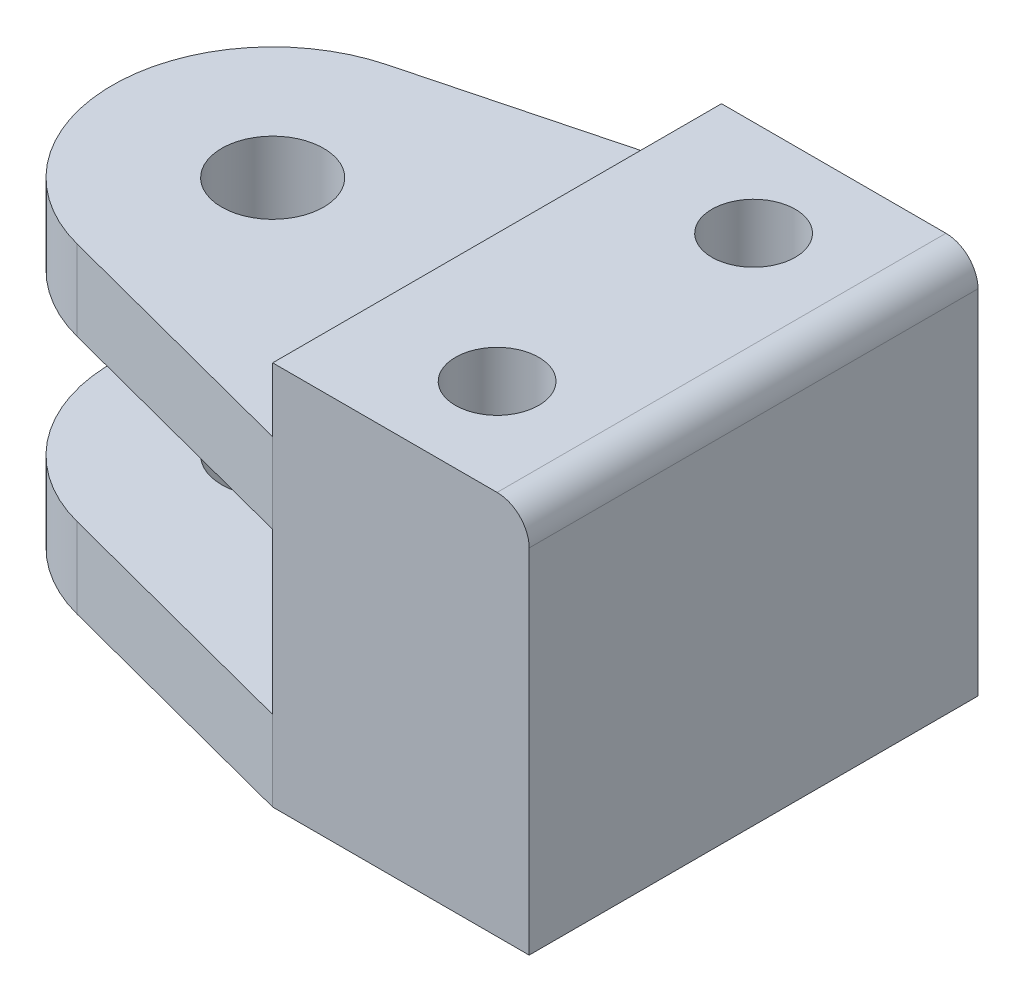
ISO-10303-21;
HEADER;
FILE_DESCRIPTION(('STEP AP214'),'2;1');
FILE_NAME('part.step','',(''),(''),'','','');
FILE_SCHEMA(('AUTOMOTIVE_DESIGN { 1 0 10303 214 1 1 1 1 }'));
ENDSEC;
DATA;
#1=APPLICATION_CONTEXT('core data for automotive mechanical design processes');
#2=APPLICATION_PROTOCOL_DEFINITION('international standard','automotive_design',2000,#1);
#3=PRODUCT_CONTEXT('',#1,'mechanical');
#4=PRODUCT('Part','Part','',(#3));
#5=PRODUCT_RELATED_PRODUCT_CATEGORY('part','',(#4));
#6=PRODUCT_DEFINITION_FORMATION('','',#4);
#7=PRODUCT_DEFINITION_CONTEXT('part definition',#1,'design');
#8=PRODUCT_DEFINITION('design','',#6,#7);
#9=PRODUCT_DEFINITION_SHAPE('','',#8);
#10=(LENGTH_UNIT() NAMED_UNIT(*) SI_UNIT(.MILLI.,.METRE.));
#11=(NAMED_UNIT(*) PLANE_ANGLE_UNIT() SI_UNIT($,.RADIAN.));
#12=(NAMED_UNIT(*) SI_UNIT($,.STERADIAN.) SOLID_ANGLE_UNIT());
#13=UNCERTAINTY_MEASURE_WITH_UNIT(LENGTH_MEASURE(1.E-05),#10,'distance_accuracy_value','');
#14=(GEOMETRIC_REPRESENTATION_CONTEXT(3) GLOBAL_UNCERTAINTY_ASSIGNED_CONTEXT((#13)) GLOBAL_UNIT_ASSIGNED_CONTEXT((#10,
#11,#12)) REPRESENTATION_CONTEXT('',''));
#15=CARTESIAN_POINT('',(0.,0.,0.));
#16=DIRECTION('',(0.,0.,1.));
#17=DIRECTION('',(1.,0.,0.));
#18=AXIS2_PLACEMENT_3D('',#15,#16,#17);
#19=CARTESIAN_POINT('',(11.,7.,-4.));
#20=DIRECTION('',(0.,1.,0.));
#21=DIRECTION('',(0.,0.,1.));
#22=AXIS2_PLACEMENT_3D('',#19,#20,#21);
#23=CYLINDRICAL_SURFACE('',#22,1.29999999999999);
#24=CARTESIAN_POINT('',(11.,7.,-4.));
#25=DIRECTION('',(0.,1.,0.));
#26=DIRECTION('',(0.,0.,1.));
#27=AXIS2_PLACEMENT_3D('',#24,#25,#26);
#28=CIRCLE('',#27,1.29999999999999);
#29=CARTESIAN_POINT('',(11.,7.,-2.70000000000001));
#30=VERTEX_POINT('',#29);
#31=EDGE_CURVE('E307',#30,#30,#28,.T.);
#32=ORIENTED_EDGE('',*,*,#31,.T.);
#33=EDGE_LOOP('',(#32));
#34=FACE_BOUND('',#33,.T.);
#35=CARTESIAN_POINT('',(11.,-2.,-4.));
#36=DIRECTION('',(0.,-1.,0.));
#37=DIRECTION('',(0.,0.,-1.));
#38=AXIS2_PLACEMENT_3D('',#35,#36,#37);
#39=CIRCLE('',#38,1.29999999999999);
#40=CARTESIAN_POINT('',(11.,-2.,-5.29999999999999));
#41=VERTEX_POINT('',#40);
#42=EDGE_CURVE('E247',#41,#41,#39,.F.);
#43=ORIENTED_EDGE('',*,*,#42,.F.);
#44=EDGE_LOOP('',(#43));
#45=FACE_BOUND('',#44,.T.);
#46=ADVANCED_FACE('F36',(#34,#45),#23,.F.);
#47=CARTESIAN_POINT('',(11.,7.,4.));
#48=DIRECTION('',(0.,1.,0.));
#49=DIRECTION('',(0.,0.,1.));
#50=AXIS2_PLACEMENT_3D('',#47,#48,#49);
#51=CYLINDRICAL_SURFACE('',#50,1.29999999999999);
#52=CARTESIAN_POINT('',(11.,7.,4.));
#53=DIRECTION('',(0.,1.,0.));
#54=DIRECTION('',(0.,0.,1.));
#55=AXIS2_PLACEMENT_3D('',#52,#53,#54);
#56=CIRCLE('',#55,1.29999999999999);
#57=CARTESIAN_POINT('',(11.,7.,5.29999999999999));
#58=VERTEX_POINT('',#57);
#59=EDGE_CURVE('E304',#58,#58,#56,.T.);
#60=ORIENTED_EDGE('',*,*,#59,.T.);
#61=EDGE_LOOP('',(#60));
#62=FACE_BOUND('',#61,.T.);
#63=CARTESIAN_POINT('',(11.,-2.,4.));
#64=DIRECTION('',(0.,-1.,0.));
#65=DIRECTION('',(0.,0.,-1.));
#66=AXIS2_PLACEMENT_3D('',#63,#64,#65);
#67=CIRCLE('',#66,1.29999999999999);
#68=CARTESIAN_POINT('',(11.,-2.,2.70000000000001));
#69=VERTEX_POINT('',#68);
#70=EDGE_CURVE('E293',#69,#69,#67,.F.);
#71=ORIENTED_EDGE('',*,*,#70,.F.);
#72=EDGE_LOOP('',(#71));
#73=FACE_BOUND('',#72,.T.);
#74=ADVANCED_FACE('F466',(#62,#73),#51,.F.);
#75=CARTESIAN_POINT('',(7.,-5.,7.));
#76=DIRECTION('',(1.,0.,0.));
#77=DIRECTION('',(0.,0.,-1.));
#78=AXIS2_PLACEMENT_3D('',#75,#76,#77);
#79=PLANE('',#78);
#80=DIRECTION('',(0.,0.,-1.));
#81=VECTOR('',#80,1.);
#82=CARTESIAN_POINT('',(7.,5.,0.));
#83=LINE('',#82,#81);
#84=CARTESIAN_POINT('',(7.,5.,7.));
#85=VERTEX_POINT('',#84);
#86=CARTESIAN_POINT('',(7.,5.,-7.));
#87=VERTEX_POINT('',#86);
#88=EDGE_CURVE('E353',#85,#87,#83,.T.);
#89=ORIENTED_EDGE('',*,*,#88,.F.);
#90=DIRECTION('',(0.,1.,0.));
#91=VECTOR('',#90,1.);
#92=CARTESIAN_POINT('',(7.,-5.,7.));
#93=LINE('',#92,#91);
#94=CARTESIAN_POINT('',(7.,7.,7.));
#95=VERTEX_POINT('',#94);
#96=EDGE_CURVE('E403',#85,#95,#93,.T.);
#97=ORIENTED_EDGE('',*,*,#96,.T.);
#98=DIRECTION('',(0.,0.,-1.));
#99=VECTOR('',#98,1.);
#100=CARTESIAN_POINT('',(7.,7.,7.));
#101=LINE('',#100,#99);
#102=CARTESIAN_POINT('',(7.,7.,-7.));
#103=VERTEX_POINT('',#102);
#104=EDGE_CURVE('E382',#95,#103,#101,.T.);
#105=ORIENTED_EDGE('',*,*,#104,.T.);
#106=DIRECTION('',(0.,1.,0.));
#107=VECTOR('',#106,1.);
#108=CARTESIAN_POINT('',(7.,-5.,-7.));
#109=LINE('',#108,#107);
#110=EDGE_CURVE('E408',#87,#103,#109,.T.);
#111=ORIENTED_EDGE('',*,*,#110,.F.);
#112=EDGE_LOOP('',(#89,#97,#105,#111));
#113=FACE_BOUND('',#112,.T.);
#114=ADVANCED_FACE('F428',(#113),#79,.F.);
#115=CARTESIAN_POINT('',(15.,-5.,7.));
#116=DIRECTION('',(1.,0.,0.));
#117=DIRECTION('',(0.,0.,-1.));
#118=AXIS2_PLACEMENT_3D('',#115,#116,#117);
#119=PLANE('',#118);
#120=DIRECTION('',(0.,1.,0.));
#121=VECTOR('',#120,1.);
#122=CARTESIAN_POINT('',(15.,-5.,-7.));
#123=LINE('',#122,#121);
#124=CARTESIAN_POINT('',(15.,-5.,-7.));
#125=VERTEX_POINT('',#124);
#126=CARTESIAN_POINT('',(15.,6.,-7.));
#127=VERTEX_POINT('',#126);
#128=EDGE_CURVE('E396',#125,#127,#123,.T.);
#129=ORIENTED_EDGE('',*,*,#128,.T.);
#130=DIRECTION('',(0.,0.,-1.));
#131=VECTOR('',#130,1.);
#132=CARTESIAN_POINT('',(15.,6.,7.));
#133=LINE('',#132,#131);
#134=CARTESIAN_POINT('',(15.,6.,7.));
#135=VERTEX_POINT('',#134);
#136=EDGE_CURVE('E44',#127,#135,#133,.F.);
#137=ORIENTED_EDGE('',*,*,#136,.T.);
#138=DIRECTION('',(0.,1.,0.));
#139=VECTOR('',#138,1.);
#140=CARTESIAN_POINT('',(15.,-5.,7.));
#141=LINE('',#140,#139);
#142=CARTESIAN_POINT('',(15.,-5.,7.));
#143=VERTEX_POINT('',#142);
#144=EDGE_CURVE('E397',#143,#135,#141,.T.);
#145=ORIENTED_EDGE('',*,*,#144,.F.);
#146=DIRECTION('',(0.,0.,-1.));
#147=VECTOR('',#146,1.);
#148=CARTESIAN_POINT('',(15.,-5.,7.));
#149=LINE('',#148,#147);
#150=EDGE_CURVE('E387',#143,#125,#149,.T.);
#151=ORIENTED_EDGE('',*,*,#150,.T.);
#152=EDGE_LOOP('',(#129,#137,#145,#151));
#153=FACE_BOUND('',#152,.T.);
#154=ADVANCED_FACE('F522',(#153),#119,.T.);
#155=CARTESIAN_POINT('',(15.,-5.,7.));
#156=DIRECTION('',(0.,0.,-1.));
#157=DIRECTION('',(-1.,0.,0.));
#158=AXIS2_PLACEMENT_3D('',#155,#156,#157);
#159=PLANE('',#158);
#160=ORIENTED_EDGE('',*,*,#144,.T.);
#161=CARTESIAN_POINT('',(14.,6.,7.));
#162=DIRECTION('',(0.,0.,-1.));
#163=DIRECTION('',(-1.,0.,0.));
#164=AXIS2_PLACEMENT_3D('',#161,#162,#163);
#165=CIRCLE('',#164,1.);
#166=CARTESIAN_POINT('',(14.,7.,7.));
#167=VERTEX_POINT('',#166);
#168=EDGE_CURVE('E11',#135,#167,#165,.F.);
#169=ORIENTED_EDGE('',*,*,#168,.T.);
#170=DIRECTION('',(-1.,0.,0.));
#171=VECTOR('',#170,1.);
#172=CARTESIAN_POINT('',(15.,7.,7.));
#173=LINE('',#172,#171);
#174=EDGE_CURVE('E385',#167,#95,#173,.T.);
#175=ORIENTED_EDGE('',*,*,#174,.T.);
#176=ORIENTED_EDGE('',*,*,#96,.F.);
#177=DIRECTION('',(0.,-1.,0.));
#178=VECTOR('',#177,1.);
#179=CARTESIAN_POINT('',(7.,5.,7.));
#180=LINE('',#179,#178);
#181=CARTESIAN_POINT('',(7.,2.5,7.));
#182=VERTEX_POINT('',#181);
#183=EDGE_CURVE('E371',#85,#182,#180,.T.);
#184=ORIENTED_EDGE('',*,*,#183,.T.);
#185=CARTESIAN_POINT('',(7.,-2.5,7.));
#186=VERTEX_POINT('',#185);
#187=EDGE_CURVE('E402',#186,#182,#93,.T.);
#188=ORIENTED_EDGE('',*,*,#187,.F.);
#189=CARTESIAN_POINT('',(7.,-5.,7.));
#190=VERTEX_POINT('',#189);
#191=EDGE_CURVE('E400',#190,#186,#93,.T.);
#192=ORIENTED_EDGE('',*,*,#191,.F.);
#193=DIRECTION('',(-1.,0.,0.));
#194=VECTOR('',#193,1.);
#195=CARTESIAN_POINT('',(15.,-5.,7.));
#196=LINE('',#195,#194);
#197=EDGE_CURVE('E393',#143,#190,#196,.T.);
#198=ORIENTED_EDGE('',*,*,#197,.F.);
#199=EDGE_LOOP('',(#160,#169,#175,#176,#184,#188,#192,#198));
#200=FACE_BOUND('',#199,.T.);
#201=ADVANCED_FACE('F439',(#200),#159,.F.);
#202=CARTESIAN_POINT('',(7.,-2.5,-7.));
#203=VERTEX_POINT('',#202);
#204=CARTESIAN_POINT('',(7.,2.5,-7.));
#205=VERTEX_POINT('',#204);
#206=EDGE_CURVE('E407',#203,#205,#109,.T.);
#207=ORIENTED_EDGE('',*,*,#206,.F.);
#208=DIRECTION('',(0.,0.,-1.));
#209=VECTOR('',#208,1.);
#210=CARTESIAN_POINT('',(7.,-2.5,0.));
#211=LINE('',#210,#209);
#212=EDGE_CURVE('E315',#186,#203,#211,.T.);
#213=ORIENTED_EDGE('',*,*,#212,.F.);
#214=ORIENTED_EDGE('',*,*,#187,.T.);
#215=DIRECTION('',(0.,0.,-1.));
#216=VECTOR('',#215,1.);
#217=CARTESIAN_POINT('',(7.,2.5,0.));
#218=LINE('',#217,#216);
#219=EDGE_CURVE('E345',#182,#205,#218,.T.);
#220=ORIENTED_EDGE('',*,*,#219,.T.);
#221=EDGE_LOOP('',(#207,#213,#214,#220));
#222=FACE_BOUND('',#221,.T.);
#223=ADVANCED_FACE('F435',(#222),#79,.F.);
#224=CARTESIAN_POINT('',(15.,-5.,-7.));
#225=DIRECTION('',(0.,0.,-1.));
#226=DIRECTION('',(-1.,0.,0.));
#227=AXIS2_PLACEMENT_3D('',#224,#225,#226);
#228=PLANE('',#227);
#229=DIRECTION('',(-1.,0.,0.));
#230=VECTOR('',#229,1.);
#231=CARTESIAN_POINT('',(15.,7.,-7.));
#232=LINE('',#231,#230);
#233=CARTESIAN_POINT('',(14.,7.,-7.));
#234=VERTEX_POINT('',#233);
#235=EDGE_CURVE('E380',#234,#103,#232,.T.);
#236=ORIENTED_EDGE('',*,*,#235,.F.);
#237=CARTESIAN_POINT('',(14.,6.,-7.));
#238=DIRECTION('',(0.,0.,-1.));
#239=DIRECTION('',(-1.,0.,0.));
#240=AXIS2_PLACEMENT_3D('',#237,#238,#239);
#241=CIRCLE('',#240,1.);
#242=EDGE_CURVE('E58',#234,#127,#241,.T.);
#243=ORIENTED_EDGE('',*,*,#242,.T.);
#244=ORIENTED_EDGE('',*,*,#128,.F.);
#245=DIRECTION('',(-1.,0.,0.));
#246=VECTOR('',#245,1.);
#247=CARTESIAN_POINT('',(15.,-5.,-7.));
#248=LINE('',#247,#246);
#249=CARTESIAN_POINT('',(7.,-5.,-7.));
#250=VERTEX_POINT('',#249);
#251=EDGE_CURVE('E390',#125,#250,#248,.T.);
#252=ORIENTED_EDGE('',*,*,#251,.T.);
#253=EDGE_CURVE('E404',#250,#203,#109,.T.);
#254=ORIENTED_EDGE('',*,*,#253,.T.);
#255=ORIENTED_EDGE('',*,*,#206,.T.);
#256=DIRECTION('',(0.,-1.,0.));
#257=VECTOR('',#256,1.);
#258=CARTESIAN_POINT('',(7.,5.,-7.));
#259=LINE('',#258,#257);
#260=EDGE_CURVE('E356',#87,#205,#259,.T.);
#261=ORIENTED_EDGE('',*,*,#260,.F.);
#262=ORIENTED_EDGE('',*,*,#110,.T.);
#263=EDGE_LOOP('',(#236,#243,#244,#252,#254,#255,#261,#262));
#264=FACE_BOUND('',#263,.T.);
#265=ADVANCED_FACE('F424',(#264),#228,.T.);
#266=CARTESIAN_POINT('',(0.,-5.,0.));
#267=DIRECTION('',(0.,1.,0.));
#268=DIRECTION('',(0.,0.,1.));
#269=AXIS2_PLACEMENT_3D('',#266,#267,#268);
#270=PLANE('',#269);
#271=DIRECTION('',(0.5,0.,-0.866025403784439));
#272=VECTOR('',#271,1.);
#273=CARTESIAN_POINT('',(8.63286389632254,-5.,-4.));
#274=LINE('',#273,#272);
#275=CARTESIAN_POINT('',(8.63286389632254,-5.,-4.));
#276=VERTEX_POINT('',#275);
#277=CARTESIAN_POINT('',(9.81643194816127,-5.,-6.05));
#278=VERTEX_POINT('',#277);
#279=EDGE_CURVE('E235',#276,#278,#274,.T.);
#280=ORIENTED_EDGE('',*,*,#279,.F.);
#281=DIRECTION('',(-0.5,0.,-0.866025403784438));
#282=VECTOR('',#281,1.);
#283=CARTESIAN_POINT('',(9.81643194816127,-5.,-1.95));
#284=LINE('',#283,#282);
#285=CARTESIAN_POINT('',(9.81643194816127,-5.,-1.95));
#286=VERTEX_POINT('',#285);
#287=EDGE_CURVE('E202',#286,#276,#284,.T.);
#288=ORIENTED_EDGE('',*,*,#287,.F.);
#289=DIRECTION('',(-1.,0.,0.));
#290=VECTOR('',#289,1.);
#291=CARTESIAN_POINT('',(12.1835680518387,-5.,-1.95));
#292=LINE('',#291,#290);
#293=CARTESIAN_POINT('',(12.1835680518387,-5.,-1.95));
#294=VERTEX_POINT('',#293);
#295=EDGE_CURVE('E221',#294,#286,#292,.T.);
#296=ORIENTED_EDGE('',*,*,#295,.F.);
#297=DIRECTION('',(-0.5,0.,0.866025403784439));
#298=VECTOR('',#297,1.);
#299=CARTESIAN_POINT('',(13.3671361036775,-5.,-4.));
#300=LINE('',#299,#298);
#301=CARTESIAN_POINT('',(13.3671361036775,-5.,-4.));
#302=VERTEX_POINT('',#301);
#303=EDGE_CURVE('E224',#302,#294,#300,.T.);
#304=ORIENTED_EDGE('',*,*,#303,.F.);
#305=DIRECTION('',(0.5,0.,0.866025403784439));
#306=VECTOR('',#305,1.);
#307=CARTESIAN_POINT('',(12.1835680518387,-5.,-6.05));
#308=LINE('',#307,#306);
#309=CARTESIAN_POINT('',(12.1835680518387,-5.,-6.05));
#310=VERTEX_POINT('',#309);
#311=EDGE_CURVE('E240',#310,#302,#308,.T.);
#312=ORIENTED_EDGE('',*,*,#311,.F.);
#313=DIRECTION('',(1.,0.,0.));
#314=VECTOR('',#313,1.);
#315=CARTESIAN_POINT('',(9.81643194816127,-5.,-6.05));
#316=LINE('',#315,#314);
#317=EDGE_CURVE('E237',#278,#310,#316,.T.);
#318=ORIENTED_EDGE('',*,*,#317,.F.);
#319=EDGE_LOOP('',(#280,#288,#296,#304,#312,#318));
#320=FACE_BOUND('',#319,.T.);
#321=DIRECTION('',(1.,0.,0.));
#322=VECTOR('',#321,1.);
#323=CARTESIAN_POINT('',(9.81643194816127,-5.,1.95));
#324=LINE('',#323,#322);
#325=CARTESIAN_POINT('',(9.81643194816127,-5.,1.95));
#326=VERTEX_POINT('',#325);
#327=CARTESIAN_POINT('',(12.1835680518387,-5.,1.95));
#328=VERTEX_POINT('',#327);
#329=EDGE_CURVE('E277',#326,#328,#324,.T.);
#330=ORIENTED_EDGE('',*,*,#329,.F.);
#331=DIRECTION('',(0.5,0.,-0.866025403784439));
#332=VECTOR('',#331,1.);
#333=CARTESIAN_POINT('',(8.63286389632254,-5.,4.));
#334=LINE('',#333,#332);
#335=CARTESIAN_POINT('',(8.63286389632254,-5.,4.));
#336=VERTEX_POINT('',#335);
#337=EDGE_CURVE('E275',#336,#326,#334,.T.);
#338=ORIENTED_EDGE('',*,*,#337,.F.);
#339=DIRECTION('',(-0.5,0.,-0.866025403784439));
#340=VECTOR('',#339,1.);
#341=CARTESIAN_POINT('',(9.81643194816127,-5.,6.05));
#342=LINE('',#341,#340);
#343=CARTESIAN_POINT('',(9.81643194816127,-5.,6.05));
#344=VERTEX_POINT('',#343);
#345=EDGE_CURVE('E259',#344,#336,#342,.T.);
#346=ORIENTED_EDGE('',*,*,#345,.F.);
#347=DIRECTION('',(-1.,0.,0.));
#348=VECTOR('',#347,1.);
#349=CARTESIAN_POINT('',(12.1835680518387,-5.,6.05));
#350=LINE('',#349,#348);
#351=CARTESIAN_POINT('',(12.1835680518387,-5.,6.05));
#352=VERTEX_POINT('',#351);
#353=EDGE_CURVE('E286',#352,#344,#350,.T.);
#354=ORIENTED_EDGE('',*,*,#353,.F.);
#355=DIRECTION('',(-0.5,0.,0.866025403784439));
#356=VECTOR('',#355,1.);
#357=CARTESIAN_POINT('',(13.3671361036775,-5.,4.));
#358=LINE('',#357,#356);
#359=CARTESIAN_POINT('',(13.3671361036775,-5.,4.));
#360=VERTEX_POINT('',#359);
#361=EDGE_CURVE('E283',#360,#352,#358,.T.);
#362=ORIENTED_EDGE('',*,*,#361,.F.);
#363=DIRECTION('',(0.5,0.,0.866025403784439));
#364=VECTOR('',#363,1.);
#365=CARTESIAN_POINT('',(12.1835680518387,-5.,1.95));
#366=LINE('',#365,#364);
#367=EDGE_CURVE('E280',#328,#360,#366,.T.);
#368=ORIENTED_EDGE('',*,*,#367,.F.);
#369=EDGE_LOOP('',(#330,#338,#346,#354,#362,#368));
#370=FACE_BOUND('',#369,.T.);
#371=ORIENTED_EDGE('',*,*,#150,.F.);
#372=ORIENTED_EDGE('',*,*,#197,.T.);
#373=DIRECTION('',(0.967428838951252,0.,0.253143124665538));
#374=VECTOR('',#373,1.);
#375=CARTESIAN_POINT('',(-1.26571562332769,-5.,4.83714419475626));
#376=LINE('',#375,#374);
#377=CARTESIAN_POINT('',(-1.26571562332769,-5.,4.83714419475626));
#378=VERTEX_POINT('',#377);
#379=EDGE_CURVE('E321',#378,#190,#376,.T.);
#380=ORIENTED_EDGE('',*,*,#379,.F.);
#381=CARTESIAN_POINT('',(0.,-5.,0.));
#382=DIRECTION('',(0.,1.,0.));
#383=DIRECTION('',(0.,0.,1.));
#384=AXIS2_PLACEMENT_3D('',#381,#382,#383);
#385=CIRCLE('',#384,5.);
#386=CARTESIAN_POINT('',(-1.26571562332769,-5.,-4.83714419475626));
#387=VERTEX_POINT('',#386);
#388=EDGE_CURVE('E318',#387,#378,#385,.T.);
#389=ORIENTED_EDGE('',*,*,#388,.F.);
#390=DIRECTION('',(-0.967428838951252,0.,0.253143124665538));
#391=VECTOR('',#390,1.);
#392=CARTESIAN_POINT('',(-1.26571562332769,-5.,-4.83714419475626));
#393=LINE('',#392,#391);
#394=EDGE_CURVE('E314',#250,#387,#393,.T.);
#395=ORIENTED_EDGE('',*,*,#394,.F.);
#396=ORIENTED_EDGE('',*,*,#251,.F.);
#397=EDGE_LOOP('',(#371,#372,#380,#389,#395,#396));
#398=FACE_BOUND('',#397,.T.);
#399=CARTESIAN_POINT('',(0.,-5.,0.));
#400=DIRECTION('',(0.,1.,0.));
#401=DIRECTION('',(0.,0.,1.));
#402=AXIS2_PLACEMENT_3D('',#399,#400,#401);
#403=CIRCLE('',#402,1.59);
#404=CARTESIAN_POINT('',(0.,-5.,1.59));
#405=VERTEX_POINT('',#404);
#406=EDGE_CURVE('E311',#405,#405,#403,.T.);
#407=ORIENTED_EDGE('',*,*,#406,.T.);
#408=EDGE_LOOP('',(#407));
#409=FACE_BOUND('',#408,.T.);
#410=ADVANCED_FACE('F515',(#320,#370,#398,#409),#270,.F.);
#411=CARTESIAN_POINT('',(0.,7.,0.));
#412=DIRECTION('',(0.,1.,0.));
#413=DIRECTION('',(0.,0.,1.));
#414=AXIS2_PLACEMENT_3D('',#411,#412,#413);
#415=PLANE('',#414);
#416=ORIENTED_EDGE('',*,*,#59,.F.);
#417=EDGE_LOOP('',(#416));
#418=FACE_BOUND('',#417,.T.);
#419=ORIENTED_EDGE('',*,*,#31,.F.);
#420=EDGE_LOOP('',(#419));
#421=FACE_BOUND('',#420,.T.);
#422=ORIENTED_EDGE('',*,*,#174,.F.);
#423=DIRECTION('',(0.,0.,-1.));
#424=VECTOR('',#423,1.);
#425=CARTESIAN_POINT('',(14.,7.,0.));
#426=LINE('',#425,#424);
#427=EDGE_CURVE('E399',#167,#234,#426,.T.);
#428=ORIENTED_EDGE('',*,*,#427,.T.);
#429=ORIENTED_EDGE('',*,*,#235,.T.);
#430=ORIENTED_EDGE('',*,*,#104,.F.);
#431=EDGE_LOOP('',(#422,#428,#429,#430));
#432=FACE_BOUND('',#431,.T.);
#433=ADVANCED_FACE('F419',(#418,#421,#432),#415,.T.);
#434=CARTESIAN_POINT('',(-1.26571562332769,5.,-4.83714419475626));
#435=DIRECTION('',(0.253143124665538,0.,0.967428838951252));
#436=DIRECTION('',(0.967428838951252,0.,-0.253143124665538));
#437=AXIS2_PLACEMENT_3D('',#434,#435,#436);
#438=PLANE('',#437);
#439=DIRECTION('',(-0.967428838951252,0.,0.253143124665538));
#440=VECTOR('',#439,1.);
#441=CARTESIAN_POINT('',(-1.26571562332769,2.5,-4.83714419475626));
#442=LINE('',#441,#440);
#443=CARTESIAN_POINT('',(-1.26571562332769,2.5,-4.83714419475626));
#444=VERTEX_POINT('',#443);
#445=EDGE_CURVE('E359',#205,#444,#442,.T.);
#446=ORIENTED_EDGE('',*,*,#445,.T.);
#447=DIRECTION('',(0.,-1.,0.));
#448=VECTOR('',#447,1.);
#449=CARTESIAN_POINT('',(-1.26571562332769,5.,-4.83714419475626));
#450=LINE('',#449,#448);
#451=CARTESIAN_POINT('',(-1.26571562332769,5.,-4.83714419475626));
#452=VERTEX_POINT('',#451);
#453=EDGE_CURVE('E377',#452,#444,#450,.T.);
#454=ORIENTED_EDGE('',*,*,#453,.F.);
#455=DIRECTION('',(-0.967428838951252,0.,0.253143124665538));
#456=VECTOR('',#455,1.);
#457=CARTESIAN_POINT('',(-1.26571562332769,5.,-4.83714419475626));
#458=LINE('',#457,#456);
#459=EDGE_CURVE('E344',#87,#452,#458,.T.);
#460=ORIENTED_EDGE('',*,*,#459,.F.);
#461=ORIENTED_EDGE('',*,*,#260,.T.);
#462=EDGE_LOOP('',(#446,#454,#460,#461));
#463=FACE_BOUND('',#462,.T.);
#464=ADVANCED_FACE('F450',(#463),#438,.F.);
#465=CARTESIAN_POINT('',(0.,5.,0.));
#466=DIRECTION('',(0.,-1.,0.));
#467=DIRECTION('',(0.,0.,-1.));
#468=AXIS2_PLACEMENT_3D('',#465,#466,#467);
#469=CYLINDRICAL_SURFACE('',#468,5.);
#470=CARTESIAN_POINT('',(0.,2.5,0.));
#471=DIRECTION('',(0.,1.,0.));
#472=DIRECTION('',(0.,0.,1.));
#473=AXIS2_PLACEMENT_3D('',#470,#471,#472);
#474=CIRCLE('',#473,5.);
#475=CARTESIAN_POINT('',(-1.26571562332769,2.5,4.83714419475626));
#476=VERTEX_POINT('',#475);
#477=EDGE_CURVE('E362',#444,#476,#474,.T.);
#478=ORIENTED_EDGE('',*,*,#477,.T.);
#479=DIRECTION('',(0.,-1.,0.));
#480=VECTOR('',#479,1.);
#481=CARTESIAN_POINT('',(-1.26571562332769,5.,4.83714419475626));
#482=LINE('',#481,#480);
#483=CARTESIAN_POINT('',(-1.26571562332769,5.,4.83714419475626));
#484=VERTEX_POINT('',#483);
#485=EDGE_CURVE('E374',#484,#476,#482,.T.);
#486=ORIENTED_EDGE('',*,*,#485,.F.);
#487=CARTESIAN_POINT('',(0.,5.,0.));
#488=DIRECTION('',(0.,1.,0.));
#489=DIRECTION('',(0.,0.,1.));
#490=AXIS2_PLACEMENT_3D('',#487,#488,#489);
#491=CIRCLE('',#490,5.);
#492=EDGE_CURVE('E348',#452,#484,#491,.T.);
#493=ORIENTED_EDGE('',*,*,#492,.F.);
#494=ORIENTED_EDGE('',*,*,#453,.T.);
#495=EDGE_LOOP('',(#478,#486,#493,#494));
#496=FACE_BOUND('',#495,.T.);
#497=ADVANCED_FACE('F455',(#496),#469,.T.);
#498=CARTESIAN_POINT('',(-1.26571562332769,5.,4.83714419475626));
#499=DIRECTION('',(0.253143124665538,0.,-0.967428838951252));
#500=DIRECTION('',(-0.967428838951252,0.,-0.253143124665538));
#501=AXIS2_PLACEMENT_3D('',#498,#499,#500);
#502=PLANE('',#501);
#503=DIRECTION('',(0.967428838951252,0.,0.253143124665538));
#504=VECTOR('',#503,1.);
#505=CARTESIAN_POINT('',(-1.26571562332769,2.5,4.83714419475626));
#506=LINE('',#505,#504);
#507=EDGE_CURVE('E364',#476,#182,#506,.T.);
#508=ORIENTED_EDGE('',*,*,#507,.T.);
#509=ORIENTED_EDGE('',*,*,#183,.F.);
#510=DIRECTION('',(0.967428838951252,0.,0.253143124665538));
#511=VECTOR('',#510,1.);
#512=CARTESIAN_POINT('',(-1.26571562332769,5.,4.83714419475626));
#513=LINE('',#512,#511);
#514=EDGE_CURVE('E350',#484,#85,#513,.T.);
#515=ORIENTED_EDGE('',*,*,#514,.F.);
#516=ORIENTED_EDGE('',*,*,#485,.T.);
#517=EDGE_LOOP('',(#508,#509,#515,#516));
#518=FACE_BOUND('',#517,.T.);
#519=ADVANCED_FACE('F443',(#518),#502,.F.);
#520=CARTESIAN_POINT('',(0.,5.,0.));
#521=DIRECTION('',(0.,-1.,0.));
#522=DIRECTION('',(0.,0.,-1.));
#523=AXIS2_PLACEMENT_3D('',#520,#521,#522);
#524=CYLINDRICAL_SURFACE('',#523,1.59);
#525=CARTESIAN_POINT('',(0.,5.,0.));
#526=DIRECTION('',(0.,1.,0.));
#527=DIRECTION('',(0.,0.,1.));
#528=AXIS2_PLACEMENT_3D('',#525,#526,#527);
#529=CIRCLE('',#528,1.59);
#530=CARTESIAN_POINT('',(0.,5.,1.59));
#531=VERTEX_POINT('',#530);
#532=EDGE_CURVE('E341',#531,#531,#529,.T.);
#533=ORIENTED_EDGE('',*,*,#532,.T.);
#534=EDGE_LOOP('',(#533));
#535=FACE_BOUND('',#534,.T.);
#536=CARTESIAN_POINT('',(0.,2.5,0.));
#537=DIRECTION('',(0.,1.,0.));
#538=DIRECTION('',(0.,0.,1.));
#539=AXIS2_PLACEMENT_3D('',#536,#537,#538);
#540=CIRCLE('',#539,1.59);
#541=CARTESIAN_POINT('',(0.,2.5,1.59));
#542=VERTEX_POINT('',#541);
#543=EDGE_CURVE('E339',#542,#542,#540,.T.);
#544=ORIENTED_EDGE('',*,*,#543,.F.);
#545=EDGE_LOOP('',(#544));
#546=FACE_BOUND('',#545,.T.);
#547=ADVANCED_FACE('F462',(#535,#546),#524,.F.);
#548=CARTESIAN_POINT('',(0.,5.,0.));
#549=DIRECTION('',(0.,1.,0.));
#550=DIRECTION('',(0.,0.,1.));
#551=AXIS2_PLACEMENT_3D('',#548,#549,#550);
#552=PLANE('',#551);
#553=ORIENTED_EDGE('',*,*,#532,.F.);
#554=EDGE_LOOP('',(#553));
#555=FACE_BOUND('',#554,.T.);
#556=ORIENTED_EDGE('',*,*,#459,.T.);
#557=ORIENTED_EDGE('',*,*,#492,.T.);
#558=ORIENTED_EDGE('',*,*,#514,.T.);
#559=ORIENTED_EDGE('',*,*,#88,.T.);
#560=EDGE_LOOP('',(#556,#557,#558,#559));
#561=FACE_BOUND('',#560,.T.);
#562=ADVANCED_FACE('F453',(#555,#561),#552,.T.);
#563=CARTESIAN_POINT('',(0.,2.5,0.));
#564=DIRECTION('',(0.,1.,0.));
#565=DIRECTION('',(0.,0.,1.));
#566=AXIS2_PLACEMENT_3D('',#563,#564,#565);
#567=PLANE('',#566);
#568=ORIENTED_EDGE('',*,*,#543,.T.);
#569=EDGE_LOOP('',(#568));
#570=FACE_BOUND('',#569,.T.);
#571=ORIENTED_EDGE('',*,*,#445,.F.);
#572=ORIENTED_EDGE('',*,*,#219,.F.);
#573=ORIENTED_EDGE('',*,*,#507,.F.);
#574=ORIENTED_EDGE('',*,*,#477,.F.);
#575=EDGE_LOOP('',(#571,#572,#573,#574));
#576=FACE_BOUND('',#575,.T.);
#577=ADVANCED_FACE('F447',(#570,#576),#567,.F.);
#578=CARTESIAN_POINT('',(-1.26571562332769,-5.,-4.83714419475626));
#579=DIRECTION('',(-0.253143124665538,0.,-0.967428838951252));
#580=DIRECTION('',(-0.967428838951252,0.,0.253143124665538));
#581=AXIS2_PLACEMENT_3D('',#578,#579,#580);
#582=PLANE('',#581);
#583=DIRECTION('',(-0.967428838951252,0.,0.253143124665538));
#584=VECTOR('',#583,1.);
#585=CARTESIAN_POINT('',(-1.26571562332769,-2.5,-4.83714419475626));
#586=LINE('',#585,#584);
#587=CARTESIAN_POINT('',(-1.26571562332769,-2.5,-4.83714419475626));
#588=VERTEX_POINT('',#587);
#589=EDGE_CURVE('E326',#203,#588,#586,.T.);
#590=ORIENTED_EDGE('',*,*,#589,.F.);
#591=ORIENTED_EDGE('',*,*,#253,.F.);
#592=ORIENTED_EDGE('',*,*,#394,.T.);
#593=DIRECTION('',(0.,1.,0.));
#594=VECTOR('',#593,1.);
#595=CARTESIAN_POINT('',(-1.26571562332769,-5.,-4.83714419475626));
#596=LINE('',#595,#594);
#597=EDGE_CURVE('E323',#387,#588,#596,.T.);
#598=ORIENTED_EDGE('',*,*,#597,.T.);
#599=EDGE_LOOP('',(#590,#591,#592,#598));
#600=FACE_BOUND('',#599,.T.);
#601=ADVANCED_FACE('F487',(#600),#582,.T.);
#602=CARTESIAN_POINT('',(-1.26571562332769,-5.,4.83714419475626));
#603=DIRECTION('',(-0.253143124665538,0.,0.967428838951252));
#604=DIRECTION('',(0.967428838951252,0.,0.253143124665538));
#605=AXIS2_PLACEMENT_3D('',#602,#603,#604);
#606=PLANE('',#605);
#607=DIRECTION('',(0.967428838951252,0.,0.253143124665538));
#608=VECTOR('',#607,1.);
#609=CARTESIAN_POINT('',(-1.26571562332769,-2.5,4.83714419475626));
#610=LINE('',#609,#608);
#611=CARTESIAN_POINT('',(-1.26571562332769,-2.5,4.83714419475626));
#612=VERTEX_POINT('',#611);
#613=EDGE_CURVE('E332',#612,#186,#610,.T.);
#614=ORIENTED_EDGE('',*,*,#613,.F.);
#615=DIRECTION('',(0.,1.,0.));
#616=VECTOR('',#615,1.);
#617=CARTESIAN_POINT('',(-1.26571562332769,-5.,4.83714419475626));
#618=LINE('',#617,#616);
#619=EDGE_CURVE('E337',#378,#612,#618,.T.);
#620=ORIENTED_EDGE('',*,*,#619,.F.);
#621=ORIENTED_EDGE('',*,*,#379,.T.);
#622=ORIENTED_EDGE('',*,*,#191,.T.);
#623=EDGE_LOOP('',(#614,#620,#621,#622));
#624=FACE_BOUND('',#623,.T.);
#625=ADVANCED_FACE('F483',(#624),#606,.T.);
#626=CARTESIAN_POINT('',(0.,-5.,0.));
#627=DIRECTION('',(0.,1.,0.));
#628=DIRECTION('',(0.,0.,1.));
#629=AXIS2_PLACEMENT_3D('',#626,#627,#628);
#630=CYLINDRICAL_SURFACE('',#629,1.59);
#631=ORIENTED_EDGE('',*,*,#406,.F.);
#632=EDGE_LOOP('',(#631));
#633=FACE_BOUND('',#632,.T.);
#634=CARTESIAN_POINT('',(0.,-2.5,0.));
#635=DIRECTION('',(0.,1.,0.));
#636=DIRECTION('',(0.,0.,1.));
#637=AXIS2_PLACEMENT_3D('',#634,#635,#636);
#638=CIRCLE('',#637,1.59);
#639=CARTESIAN_POINT('',(0.,-2.5,1.59));
#640=VERTEX_POINT('',#639);
#641=EDGE_CURVE('E310',#640,#640,#638,.T.);
#642=ORIENTED_EDGE('',*,*,#641,.T.);
#643=EDGE_LOOP('',(#642));
#644=FACE_BOUND('',#643,.T.);
#645=ADVANCED_FACE('F486',(#633,#644),#630,.F.);
#646=CARTESIAN_POINT('',(0.,-5.,0.));
#647=DIRECTION('',(0.,1.,0.));
#648=DIRECTION('',(0.,0.,1.));
#649=AXIS2_PLACEMENT_3D('',#646,#647,#648);
#650=CYLINDRICAL_SURFACE('',#649,5.);
#651=CARTESIAN_POINT('',(0.,-2.5,0.));
#652=DIRECTION('',(0.,1.,0.));
#653=DIRECTION('',(0.,0.,1.));
#654=AXIS2_PLACEMENT_3D('',#651,#652,#653);
#655=CIRCLE('',#654,5.);
#656=EDGE_CURVE('E329',#588,#612,#655,.T.);
#657=ORIENTED_EDGE('',*,*,#656,.F.);
#658=ORIENTED_EDGE('',*,*,#597,.F.);
#659=ORIENTED_EDGE('',*,*,#388,.T.);
#660=ORIENTED_EDGE('',*,*,#619,.T.);
#661=EDGE_LOOP('',(#657,#658,#659,#660));
#662=FACE_BOUND('',#661,.T.);
#663=ADVANCED_FACE('F481',(#662),#650,.T.);
#664=CARTESIAN_POINT('',(0.,-2.5,0.));
#665=DIRECTION('',(0.,1.,0.));
#666=DIRECTION('',(0.,0.,1.));
#667=AXIS2_PLACEMENT_3D('',#664,#665,#666);
#668=PLANE('',#667);
#669=ORIENTED_EDGE('',*,*,#641,.F.);
#670=EDGE_LOOP('',(#669));
#671=FACE_BOUND('',#670,.T.);
#672=ORIENTED_EDGE('',*,*,#589,.T.);
#673=ORIENTED_EDGE('',*,*,#656,.T.);
#674=ORIENTED_EDGE('',*,*,#613,.T.);
#675=ORIENTED_EDGE('',*,*,#212,.T.);
#676=EDGE_LOOP('',(#672,#673,#674,#675));
#677=FACE_BOUND('',#676,.T.);
#678=ADVANCED_FACE('F477',(#671,#677),#668,.T.);
#679=CARTESIAN_POINT('',(0.,-2.,0.));
#680=DIRECTION('',(0.,-1.,0.));
#681=DIRECTION('',(0.,0.,-1.));
#682=AXIS2_PLACEMENT_3D('',#679,#680,#681);
#683=PLANE('',#682);
#684=DIRECTION('',(0.5,0.,-0.866025403784439));
#685=VECTOR('',#684,1.);
#686=CARTESIAN_POINT('',(8.63286389632254,-2.,4.));
#687=LINE('',#686,#685);
#688=CARTESIAN_POINT('',(8.63286389632254,-2.,4.));
#689=VERTEX_POINT('',#688);
#690=CARTESIAN_POINT('',(9.81643194816127,-2.,1.95));
#691=VERTEX_POINT('',#690);
#692=EDGE_CURVE('E255',#689,#691,#687,.T.);
#693=ORIENTED_EDGE('',*,*,#692,.T.);
#694=DIRECTION('',(1.,0.,0.));
#695=VECTOR('',#694,1.);
#696=CARTESIAN_POINT('',(9.81643194816127,-2.,1.95));
#697=LINE('',#696,#695);
#698=CARTESIAN_POINT('',(12.1835680518387,-2.,1.95));
#699=VERTEX_POINT('',#698);
#700=EDGE_CURVE('E258',#691,#699,#697,.T.);
#701=ORIENTED_EDGE('',*,*,#700,.T.);
#702=DIRECTION('',(0.5,0.,0.866025403784439));
#703=VECTOR('',#702,1.);
#704=CARTESIAN_POINT('',(12.1835680518387,-2.,1.95));
#705=LINE('',#704,#703);
#706=CARTESIAN_POINT('',(13.3671361036775,-2.,4.));
#707=VERTEX_POINT('',#706);
#708=EDGE_CURVE('E262',#699,#707,#705,.T.);
#709=ORIENTED_EDGE('',*,*,#708,.T.);
#710=DIRECTION('',(-0.5,0.,0.866025403784439));
#711=VECTOR('',#710,1.);
#712=CARTESIAN_POINT('',(13.3671361036775,-2.,4.));
#713=LINE('',#712,#711);
#714=CARTESIAN_POINT('',(12.1835680518387,-2.,6.05));
#715=VERTEX_POINT('',#714);
#716=EDGE_CURVE('E265',#707,#715,#713,.T.);
#717=ORIENTED_EDGE('',*,*,#716,.T.);
#718=DIRECTION('',(-1.,0.,0.));
#719=VECTOR('',#718,1.);
#720=CARTESIAN_POINT('',(12.1835680518387,-2.,6.05));
#721=LINE('',#720,#719);
#722=CARTESIAN_POINT('',(9.81643194816127,-2.,6.05));
#723=VERTEX_POINT('',#722);
#724=EDGE_CURVE('E268',#715,#723,#721,.T.);
#725=ORIENTED_EDGE('',*,*,#724,.T.);
#726=DIRECTION('',(-0.5,0.,-0.866025403784439));
#727=VECTOR('',#726,1.);
#728=CARTESIAN_POINT('',(9.81643194816127,-2.,6.05));
#729=LINE('',#728,#727);
#730=EDGE_CURVE('E271',#723,#689,#729,.T.);
#731=ORIENTED_EDGE('',*,*,#730,.T.);
#732=EDGE_LOOP('',(#693,#701,#709,#717,#725,#731));
#733=FACE_BOUND('',#732,.T.);
#734=ORIENTED_EDGE('',*,*,#70,.T.);
#735=EDGE_LOOP('',(#734));
#736=FACE_BOUND('',#735,.T.);
#737=ADVANCED_FACE('F480',(#733,#736),#683,.T.);
#738=CARTESIAN_POINT('',(8.63286389632254,-2.,4.));
#739=DIRECTION('',(-0.866025403784439,0.,-0.5));
#740=DIRECTION('',(-0.5,0.,0.866025403784439));
#741=AXIS2_PLACEMENT_3D('',#738,#739,#740);
#742=PLANE('',#741);
#743=ORIENTED_EDGE('',*,*,#337,.T.);
#744=DIRECTION('',(0.,-1.,0.));
#745=VECTOR('',#744,1.);
#746=CARTESIAN_POINT('',(9.81643194816127,-2.,1.95));
#747=LINE('',#746,#745);
#748=EDGE_CURVE('E274',#691,#326,#747,.T.);
#749=ORIENTED_EDGE('',*,*,#748,.F.);
#750=ORIENTED_EDGE('',*,*,#692,.F.);
#751=DIRECTION('',(0.,-1.,0.));
#752=VECTOR('',#751,1.);
#753=CARTESIAN_POINT('',(8.63286389632254,-2.,4.));
#754=LINE('',#753,#752);
#755=EDGE_CURVE('E291',#689,#336,#754,.T.);
#756=ORIENTED_EDGE('',*,*,#755,.T.);
#757=EDGE_LOOP('',(#743,#749,#750,#756));
#758=FACE_BOUND('',#757,.T.);
#759=ADVANCED_FACE('F563',(#758),#742,.F.);
#760=CARTESIAN_POINT('',(9.81643194816127,-2.,6.05));
#761=DIRECTION('',(-0.866025403784439,0.,0.5));
#762=DIRECTION('',(0.5,0.,0.866025403784439));
#763=AXIS2_PLACEMENT_3D('',#760,#761,#762);
#764=PLANE('',#763);
#765=ORIENTED_EDGE('',*,*,#345,.T.);
#766=ORIENTED_EDGE('',*,*,#755,.F.);
#767=ORIENTED_EDGE('',*,*,#730,.F.);
#768=DIRECTION('',(0.,-1.,0.));
#769=VECTOR('',#768,1.);
#770=CARTESIAN_POINT('',(9.81643194816127,-2.,6.05));
#771=LINE('',#770,#769);
#772=EDGE_CURVE('E294',#723,#344,#771,.T.);
#773=ORIENTED_EDGE('',*,*,#772,.T.);
#774=EDGE_LOOP('',(#765,#766,#767,#773));
#775=FACE_BOUND('',#774,.T.);
#776=ADVANCED_FACE('F565',(#775),#764,.F.);
#777=CARTESIAN_POINT('',(12.1835680518387,-2.,6.05));
#778=DIRECTION('',(0.,0.,1.));
#779=DIRECTION('',(1.,0.,0.));
#780=AXIS2_PLACEMENT_3D('',#777,#778,#779);
#781=PLANE('',#780);
#782=ORIENTED_EDGE('',*,*,#353,.T.);
#783=ORIENTED_EDGE('',*,*,#772,.F.);
#784=ORIENTED_EDGE('',*,*,#724,.F.);
#785=DIRECTION('',(0.,-1.,0.));
#786=VECTOR('',#785,1.);
#787=CARTESIAN_POINT('',(12.1835680518387,-2.,6.05));
#788=LINE('',#787,#786);
#789=EDGE_CURVE('E296',#715,#352,#788,.T.);
#790=ORIENTED_EDGE('',*,*,#789,.T.);
#791=EDGE_LOOP('',(#782,#783,#784,#790));
#792=FACE_BOUND('',#791,.T.);
#793=ADVANCED_FACE('F568',(#792),#781,.F.);
#794=CARTESIAN_POINT('',(13.3671361036775,-2.,4.));
#795=DIRECTION('',(0.866025403784439,0.,0.5));
#796=DIRECTION('',(0.5,0.,-0.866025403784439));
#797=AXIS2_PLACEMENT_3D('',#794,#795,#796);
#798=PLANE('',#797);
#799=ORIENTED_EDGE('',*,*,#361,.T.);
#800=ORIENTED_EDGE('',*,*,#789,.F.);
#801=ORIENTED_EDGE('',*,*,#716,.F.);
#802=DIRECTION('',(0.,-1.,0.));
#803=VECTOR('',#802,1.);
#804=CARTESIAN_POINT('',(13.3671361036775,-2.,4.));
#805=LINE('',#804,#803);
#806=EDGE_CURVE('E298',#707,#360,#805,.T.);
#807=ORIENTED_EDGE('',*,*,#806,.T.);
#808=EDGE_LOOP('',(#799,#800,#801,#807));
#809=FACE_BOUND('',#808,.T.);
#810=ADVANCED_FACE('F572',(#809),#798,.F.);
#811=CARTESIAN_POINT('',(12.1835680518387,-2.,1.95));
#812=DIRECTION('',(0.866025403784439,0.,-0.5));
#813=DIRECTION('',(-0.5,0.,-0.866025403784439));
#814=AXIS2_PLACEMENT_3D('',#811,#812,#813);
#815=PLANE('',#814);
#816=ORIENTED_EDGE('',*,*,#367,.T.);
#817=ORIENTED_EDGE('',*,*,#806,.F.);
#818=ORIENTED_EDGE('',*,*,#708,.F.);
#819=DIRECTION('',(0.,-1.,0.));
#820=VECTOR('',#819,1.);
#821=CARTESIAN_POINT('',(12.1835680518387,-2.,1.95));
#822=LINE('',#821,#820);
#823=EDGE_CURVE('E300',#699,#328,#822,.T.);
#824=ORIENTED_EDGE('',*,*,#823,.T.);
#825=EDGE_LOOP('',(#816,#817,#818,#824));
#826=FACE_BOUND('',#825,.T.);
#827=ADVANCED_FACE('F576',(#826),#815,.F.);
#828=CARTESIAN_POINT('',(9.81643194816127,-2.,1.95));
#829=DIRECTION('',(0.,0.,-1.));
#830=DIRECTION('',(-1.,0.,0.));
#831=AXIS2_PLACEMENT_3D('',#828,#829,#830);
#832=PLANE('',#831);
#833=ORIENTED_EDGE('',*,*,#329,.T.);
#834=ORIENTED_EDGE('',*,*,#823,.F.);
#835=ORIENTED_EDGE('',*,*,#700,.F.);
#836=ORIENTED_EDGE('',*,*,#748,.T.);
#837=EDGE_LOOP('',(#833,#834,#835,#836));
#838=FACE_BOUND('',#837,.T.);
#839=ADVANCED_FACE('F580',(#838),#832,.F.);
#840=CARTESIAN_POINT('',(0.,-2.,0.));
#841=DIRECTION('',(0.,-1.,0.));
#842=DIRECTION('',(0.,0.,-1.));
#843=AXIS2_PLACEMENT_3D('',#840,#841,#842);
#844=PLANE('',#843);
#845=DIRECTION('',(-0.5,0.,-0.866025403784438));
#846=VECTOR('',#845,1.);
#847=CARTESIAN_POINT('',(9.81643194816127,-2.,-1.95));
#848=LINE('',#847,#846);
#849=CARTESIAN_POINT('',(9.81643194816127,-2.,-1.95));
#850=VERTEX_POINT('',#849);
#851=CARTESIAN_POINT('',(8.63286389632254,-2.,-4.));
#852=VERTEX_POINT('',#851);
#853=EDGE_CURVE('E199',#850,#852,#848,.T.);
#854=ORIENTED_EDGE('',*,*,#853,.T.);
#855=DIRECTION('',(0.5,0.,-0.866025403784439));
#856=VECTOR('',#855,1.);
#857=CARTESIAN_POINT('',(8.63286389632254,-2.,-4.));
#858=LINE('',#857,#856);
#859=CARTESIAN_POINT('',(9.81643194816127,-2.,-6.05));
#860=VERTEX_POINT('',#859);
#861=EDGE_CURVE('E210',#852,#860,#858,.T.);
#862=ORIENTED_EDGE('',*,*,#861,.T.);
#863=DIRECTION('',(1.,0.,0.));
#864=VECTOR('',#863,1.);
#865=CARTESIAN_POINT('',(9.81643194816127,-2.,-6.05));
#866=LINE('',#865,#864);
#867=CARTESIAN_POINT('',(12.1835680518387,-2.,-6.05));
#868=VERTEX_POINT('',#867);
#869=EDGE_CURVE('E215',#860,#868,#866,.T.);
#870=ORIENTED_EDGE('',*,*,#869,.T.);
#871=DIRECTION('',(0.5,0.,0.866025403784439));
#872=VECTOR('',#871,1.);
#873=CARTESIAN_POINT('',(12.1835680518387,-2.,-6.05));
#874=LINE('',#873,#872);
#875=CARTESIAN_POINT('',(13.3671361036775,-2.,-4.));
#876=VERTEX_POINT('',#875);
#877=EDGE_CURVE('E228',#868,#876,#874,.T.);
#878=ORIENTED_EDGE('',*,*,#877,.T.);
#879=DIRECTION('',(-0.5,0.,0.866025403784439));
#880=VECTOR('',#879,1.);
#881=CARTESIAN_POINT('',(13.3671361036775,-2.,-4.));
#882=LINE('',#881,#880);
#883=CARTESIAN_POINT('',(12.1835680518387,-2.,-1.95));
#884=VERTEX_POINT('',#883);
#885=EDGE_CURVE('E231',#876,#884,#882,.T.);
#886=ORIENTED_EDGE('',*,*,#885,.T.);
#887=DIRECTION('',(-1.,0.,0.));
#888=VECTOR('',#887,1.);
#889=CARTESIAN_POINT('',(12.1835680518387,-2.,-1.95));
#890=LINE('',#889,#888);
#891=EDGE_CURVE('E207',#884,#850,#890,.T.);
#892=ORIENTED_EDGE('',*,*,#891,.T.);
#893=EDGE_LOOP('',(#854,#862,#870,#878,#886,#892));
#894=FACE_BOUND('',#893,.T.);
#895=ORIENTED_EDGE('',*,*,#42,.T.);
#896=EDGE_LOOP('',(#895));
#897=FACE_BOUND('',#896,.T.);
#898=ADVANCED_FACE('F217',(#894,#897),#844,.T.);
#899=CARTESIAN_POINT('',(9.81643194816127,-2.,-1.95));
#900=DIRECTION('',(-0.866025403784438,0.,0.5));
#901=DIRECTION('',(0.5,0.,0.866025403784439));
#902=AXIS2_PLACEMENT_3D('',#899,#900,#901);
#903=PLANE('',#902);
#904=ORIENTED_EDGE('',*,*,#287,.T.);
#905=DIRECTION('',(0.,-1.,0.));
#906=VECTOR('',#905,1.);
#907=CARTESIAN_POINT('',(8.63286389632254,-2.,-4.));
#908=LINE('',#907,#906);
#909=EDGE_CURVE('E195',#852,#276,#908,.T.);
#910=ORIENTED_EDGE('',*,*,#909,.F.);
#911=ORIENTED_EDGE('',*,*,#853,.F.);
#912=DIRECTION('',(0.,-1.,0.));
#913=VECTOR('',#912,1.);
#914=CARTESIAN_POINT('',(9.81643194816127,-2.,-1.95));
#915=LINE('',#914,#913);
#916=EDGE_CURVE('E245',#850,#286,#915,.T.);
#917=ORIENTED_EDGE('',*,*,#916,.T.);
#918=EDGE_LOOP('',(#904,#910,#911,#917));
#919=FACE_BOUND('',#918,.T.);
#920=ADVANCED_FACE('F197',(#919),#903,.F.);
#921=CARTESIAN_POINT('',(12.1835680518387,-2.,-1.95));
#922=DIRECTION('',(0.,0.,1.));
#923=DIRECTION('',(1.,0.,0.));
#924=AXIS2_PLACEMENT_3D('',#921,#922,#923);
#925=PLANE('',#924);
#926=ORIENTED_EDGE('',*,*,#295,.T.);
#927=ORIENTED_EDGE('',*,*,#916,.F.);
#928=ORIENTED_EDGE('',*,*,#891,.F.);
#929=DIRECTION('',(0.,-1.,0.));
#930=VECTOR('',#929,1.);
#931=CARTESIAN_POINT('',(12.1835680518387,-2.,-1.95));
#932=LINE('',#931,#930);
#933=EDGE_CURVE('E248',#884,#294,#932,.T.);
#934=ORIENTED_EDGE('',*,*,#933,.T.);
#935=EDGE_LOOP('',(#926,#927,#928,#934));
#936=FACE_BOUND('',#935,.T.);
#937=ADVANCED_FACE('F560',(#936),#925,.F.);
#938=CARTESIAN_POINT('',(13.3671361036775,-2.,-4.));
#939=DIRECTION('',(0.866025403784439,0.,0.5));
#940=DIRECTION('',(0.5,0.,-0.866025403784439));
#941=AXIS2_PLACEMENT_3D('',#938,#939,#940);
#942=PLANE('',#941);
#943=ORIENTED_EDGE('',*,*,#303,.T.);
#944=ORIENTED_EDGE('',*,*,#933,.F.);
#945=ORIENTED_EDGE('',*,*,#885,.F.);
#946=DIRECTION('',(0.,-1.,0.));
#947=VECTOR('',#946,1.);
#948=CARTESIAN_POINT('',(13.3671361036775,-2.,-4.));
#949=LINE('',#948,#947);
#950=EDGE_CURVE('E250',#876,#302,#949,.T.);
#951=ORIENTED_EDGE('',*,*,#950,.T.);
#952=EDGE_LOOP('',(#943,#944,#945,#951));
#953=FACE_BOUND('',#952,.T.);
#954=ADVANCED_FACE('F642',(#953),#942,.F.);
#955=CARTESIAN_POINT('',(12.1835680518387,-2.,-6.05));
#956=DIRECTION('',(0.866025403784439,0.,-0.5));
#957=DIRECTION('',(-0.5,0.,-0.866025403784439));
#958=AXIS2_PLACEMENT_3D('',#955,#956,#957);
#959=PLANE('',#958);
#960=ORIENTED_EDGE('',*,*,#311,.T.);
#961=ORIENTED_EDGE('',*,*,#950,.F.);
#962=ORIENTED_EDGE('',*,*,#877,.F.);
#963=DIRECTION('',(0.,-1.,0.));
#964=VECTOR('',#963,1.);
#965=CARTESIAN_POINT('',(12.1835680518387,-2.,-6.05));
#966=LINE('',#965,#964);
#967=EDGE_CURVE('E252',#868,#310,#966,.T.);
#968=ORIENTED_EDGE('',*,*,#967,.T.);
#969=EDGE_LOOP('',(#960,#961,#962,#968));
#970=FACE_BOUND('',#969,.T.);
#971=ADVANCED_FACE('F553',(#970),#959,.F.);
#972=CARTESIAN_POINT('',(9.81643194816127,-2.,-6.05));
#973=DIRECTION('',(0.,0.,-1.));
#974=DIRECTION('',(-1.,0.,0.));
#975=AXIS2_PLACEMENT_3D('',#972,#973,#974);
#976=PLANE('',#975);
#977=ORIENTED_EDGE('',*,*,#317,.T.);
#978=ORIENTED_EDGE('',*,*,#967,.F.);
#979=ORIENTED_EDGE('',*,*,#869,.F.);
#980=DIRECTION('',(0.,-1.,0.));
#981=VECTOR('',#980,1.);
#982=CARTESIAN_POINT('',(9.81643194816127,-2.,-6.05));
#983=LINE('',#982,#981);
#984=EDGE_CURVE('E206',#860,#278,#983,.T.);
#985=ORIENTED_EDGE('',*,*,#984,.T.);
#986=EDGE_LOOP('',(#977,#978,#979,#985));
#987=FACE_BOUND('',#986,.T.);
#988=ADVANCED_FACE('F548',(#987),#976,.F.);
#989=CARTESIAN_POINT('',(8.63286389632254,-2.,-4.));
#990=DIRECTION('',(-0.866025403784439,0.,-0.5));
#991=DIRECTION('',(-0.5,0.,0.866025403784439));
#992=AXIS2_PLACEMENT_3D('',#989,#990,#991);
#993=PLANE('',#992);
#994=ORIENTED_EDGE('',*,*,#279,.T.);
#995=ORIENTED_EDGE('',*,*,#984,.F.);
#996=ORIENTED_EDGE('',*,*,#861,.F.);
#997=ORIENTED_EDGE('',*,*,#909,.T.);
#998=EDGE_LOOP('',(#994,#995,#996,#997));
#999=FACE_BOUND('',#998,.T.);
#1000=ADVANCED_FACE('F211',(#999),#993,.F.);
#1001=CARTESIAN_POINT('',(14.,6.,0.));
#1002=DIRECTION('',(0.,0.,-1.));
#1003=DIRECTION('',(-1.,0.,0.));
#1004=AXIS2_PLACEMENT_3D('',#1001,#1002,#1003);
#1005=CYLINDRICAL_SURFACE('',#1004,1.);
#1006=ORIENTED_EDGE('',*,*,#168,.F.);
#1007=ORIENTED_EDGE('',*,*,#136,.F.);
#1008=ORIENTED_EDGE('',*,*,#242,.F.);
#1009=ORIENTED_EDGE('',*,*,#427,.F.);
#1010=EDGE_LOOP('',(#1006,#1007,#1008,#1009));
#1011=FACE_BOUND('',#1010,.T.);
#1012=ADVANCED_FACE('F38',(#1011),#1005,.T.);
#1013=CLOSED_SHELL('',(#46,#74,#114,#154,#201,#223,#265,#410,#433,#464,#497,#519,#547,#562,#577,
#601,#625,#645,#663,#678,#737,#759,#776,#793,#810,#827,#839,#898,#920,#937,#954,#971,#988,#1000,#1012));
#1014=MANIFOLD_SOLID_BREP('B2',#1013);
#1015=ADVANCED_BREP_SHAPE_REPRESENTATION('',(#18,#1014),#14);
#1016=SHAPE_DEFINITION_REPRESENTATION(#9,#1015);
ENDSEC;
END-ISO-10303-21;
